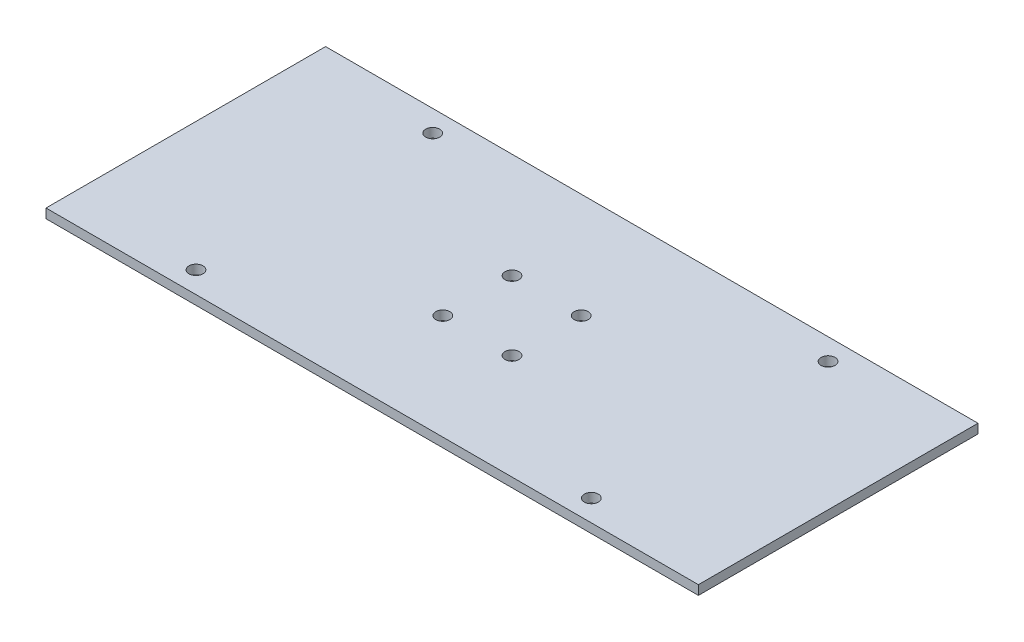
ISO-10303-21;
HEADER;
FILE_DESCRIPTION(('STEP AP214'),'2;1');
FILE_NAME('part.step','',(''),(''),'','','');
FILE_SCHEMA(('AUTOMOTIVE_DESIGN { 1 0 10303 214 1 1 1 1 }'));
ENDSEC;
DATA;
#1=APPLICATION_CONTEXT('core data for automotive mechanical design processes');
#2=APPLICATION_PROTOCOL_DEFINITION('international standard','automotive_design',2000,#1);
#3=PRODUCT_CONTEXT('',#1,'mechanical');
#4=PRODUCT('Part','Part','',(#3));
#5=PRODUCT_RELATED_PRODUCT_CATEGORY('part','',(#4));
#6=PRODUCT_DEFINITION_FORMATION('','',#4);
#7=PRODUCT_DEFINITION_CONTEXT('part definition',#1,'design');
#8=PRODUCT_DEFINITION('design','',#6,#7);
#9=PRODUCT_DEFINITION_SHAPE('','',#8);
#10=(LENGTH_UNIT() NAMED_UNIT(*) SI_UNIT(.MILLI.,.METRE.));
#11=(NAMED_UNIT(*) PLANE_ANGLE_UNIT() SI_UNIT($,.RADIAN.));
#12=(NAMED_UNIT(*) SI_UNIT($,.STERADIAN.) SOLID_ANGLE_UNIT());
#13=UNCERTAINTY_MEASURE_WITH_UNIT(LENGTH_MEASURE(1.E-05),#10,'distance_accuracy_value','');
#14=(GEOMETRIC_REPRESENTATION_CONTEXT(3) GLOBAL_UNCERTAINTY_ASSIGNED_CONTEXT((#13)) GLOBAL_UNIT_ASSIGNED_CONTEXT((#10,
#11,#12)) REPRESENTATION_CONTEXT('',''));
#15=CARTESIAN_POINT('',(0.,0.,0.));
#16=DIRECTION('',(0.,0.,1.));
#17=DIRECTION('',(1.,0.,0.));
#18=AXIS2_PLACEMENT_3D('',#15,#16,#17);
#19=CARTESIAN_POINT('',(0.,2.,0.));
#20=DIRECTION('',(0.,1.,0.));
#21=DIRECTION('',(0.,0.,1.));
#22=AXIS2_PLACEMENT_3D('',#19,#20,#21);
#23=PLANE('',#22);
#24=CARTESIAN_POINT('',(7.42499999999995,2.,7.42500000000005));
#25=DIRECTION('',(0.,1.,0.));
#26=DIRECTION('',(0.,0.,1.));
#27=AXIS2_PLACEMENT_3D('',#24,#25,#26);
#28=CIRCLE('',#27,1.5);
#29=CARTESIAN_POINT('',(7.42499999999995,2.,8.92500000000005));
#30=VERTEX_POINT('',#29);
#31=EDGE_CURVE('E148',#30,#30,#28,.T.);
#32=ORIENTED_EDGE('',*,*,#31,.F.);
#33=EDGE_LOOP('',(#32));
#34=FACE_BOUND('',#33,.T.);
#35=CARTESIAN_POINT('',(-7.425,2.,-7.425));
#36=DIRECTION('',(0.,1.,0.));
#37=DIRECTION('',(0.,0.,1.));
#38=AXIS2_PLACEMENT_3D('',#35,#36,#37);
#39=CIRCLE('',#38,1.5);
#40=CARTESIAN_POINT('',(-7.425,2.,-5.925));
#41=VERTEX_POINT('',#40);
#42=EDGE_CURVE('E136',#41,#41,#39,.T.);
#43=ORIENTED_EDGE('',*,*,#42,.F.);
#44=EDGE_LOOP('',(#43));
#45=FACE_BOUND('',#44,.T.);
#46=CARTESIAN_POINT('',(42.42,2.,25.4));
#47=DIRECTION('',(0.,1.,0.));
#48=DIRECTION('',(0.,0.,1.));
#49=AXIS2_PLACEMENT_3D('',#46,#47,#48);
#50=CIRCLE('',#49,1.5);
#51=CARTESIAN_POINT('',(42.42,2.,26.9));
#52=VERTEX_POINT('',#51);
#53=EDGE_CURVE('E124',#52,#52,#50,.T.);
#54=ORIENTED_EDGE('',*,*,#53,.F.);
#55=EDGE_LOOP('',(#54));
#56=FACE_BOUND('',#55,.T.);
#57=CARTESIAN_POINT('',(-42.42,2.,-25.4));
#58=DIRECTION('',(0.,1.,0.));
#59=DIRECTION('',(0.,0.,1.));
#60=AXIS2_PLACEMENT_3D('',#57,#58,#59);
#61=CIRCLE('',#60,1.5);
#62=CARTESIAN_POINT('',(-42.42,2.,-23.9));
#63=VERTEX_POINT('',#62);
#64=EDGE_CURVE('E103',#63,#63,#61,.T.);
#65=ORIENTED_EDGE('',*,*,#64,.F.);
#66=EDGE_LOOP('',(#65));
#67=FACE_BOUND('',#66,.T.);
#68=DIRECTION('',(0.,0.,-1.));
#69=VECTOR('',#68,1.);
#70=CARTESIAN_POINT('',(70.,2.,-30.));
#71=LINE('',#70,#69);
#72=CARTESIAN_POINT('',(70.,2.,30.));
#73=VERTEX_POINT('',#72);
#74=CARTESIAN_POINT('',(70.,2.,-30.));
#75=VERTEX_POINT('',#74);
#76=EDGE_CURVE('E88',#73,#75,#71,.T.);
#77=ORIENTED_EDGE('',*,*,#76,.T.);
#78=DIRECTION('',(-1.,0.,0.));
#79=VECTOR('',#78,1.);
#80=CARTESIAN_POINT('',(-70.,2.,-30.));
#81=LINE('',#80,#79);
#82=CARTESIAN_POINT('',(-70.,2.,-30.));
#83=VERTEX_POINT('',#82);
#84=EDGE_CURVE('E83',#75,#83,#81,.T.);
#85=ORIENTED_EDGE('',*,*,#84,.T.);
#86=DIRECTION('',(0.,0.,1.));
#87=VECTOR('',#86,1.);
#88=CARTESIAN_POINT('',(-70.,2.,-30.));
#89=LINE('',#88,#87);
#90=CARTESIAN_POINT('',(-70.,2.,30.));
#91=VERTEX_POINT('',#90);
#92=EDGE_CURVE('E86',#83,#91,#89,.T.);
#93=ORIENTED_EDGE('',*,*,#92,.T.);
#94=DIRECTION('',(1.,0.,0.));
#95=VECTOR('',#94,1.);
#96=CARTESIAN_POINT('',(-70.,2.,30.));
#97=LINE('',#96,#95);
#98=EDGE_CURVE('E53',#91,#73,#97,.T.);
#99=ORIENTED_EDGE('',*,*,#98,.T.);
#100=EDGE_LOOP('',(#77,#85,#93,#99));
#101=FACE_BOUND('',#100,.T.);
#102=CARTESIAN_POINT('',(-42.42,2.,25.4));
#103=DIRECTION('',(0.,1.,0.));
#104=DIRECTION('',(0.,0.,-1.));
#105=AXIS2_PLACEMENT_3D('',#102,#103,#104);
#106=CIRCLE('',#105,1.5);
#107=CARTESIAN_POINT('',(-42.42,2.,23.9));
#108=VERTEX_POINT('',#107);
#109=EDGE_CURVE('E118',#108,#108,#106,.T.);
#110=ORIENTED_EDGE('',*,*,#109,.F.);
#111=EDGE_LOOP('',(#110));
#112=FACE_BOUND('',#111,.T.);
#113=CARTESIAN_POINT('',(42.42,2.,-25.4));
#114=DIRECTION('',(0.,1.,0.));
#115=DIRECTION('',(0.,0.,-1.));
#116=AXIS2_PLACEMENT_3D('',#113,#114,#115);
#117=CIRCLE('',#116,1.5);
#118=CARTESIAN_POINT('',(42.42,2.,-26.9));
#119=VERTEX_POINT('',#118);
#120=EDGE_CURVE('E130',#119,#119,#117,.T.);
#121=ORIENTED_EDGE('',*,*,#120,.F.);
#122=EDGE_LOOP('',(#121));
#123=FACE_BOUND('',#122,.T.);
#124=CARTESIAN_POINT('',(7.42500000000003,2.,-7.42499999999997));
#125=DIRECTION('',(0.,1.,0.));
#126=DIRECTION('',(0.,0.,1.));
#127=AXIS2_PLACEMENT_3D('',#124,#125,#126);
#128=CIRCLE('',#127,1.5);
#129=CARTESIAN_POINT('',(7.42500000000003,2.,-5.92499999999998));
#130=VERTEX_POINT('',#129);
#131=EDGE_CURVE('E142',#130,#130,#128,.T.);
#132=ORIENTED_EDGE('',*,*,#131,.F.);
#133=EDGE_LOOP('',(#132));
#134=FACE_BOUND('',#133,.T.);
#135=CARTESIAN_POINT('',(-7.42500000000008,2.,7.42499999999992));
#136=DIRECTION('',(0.,1.,0.));
#137=DIRECTION('',(0.,0.,1.));
#138=AXIS2_PLACEMENT_3D('',#135,#136,#137);
#139=CIRCLE('',#138,1.5);
#140=CARTESIAN_POINT('',(-7.42500000000008,2.,8.92499999999992));
#141=VERTEX_POINT('',#140);
#142=EDGE_CURVE('E154',#141,#141,#139,.T.);
#143=ORIENTED_EDGE('',*,*,#142,.F.);
#144=EDGE_LOOP('',(#143));
#145=FACE_BOUND('',#144,.T.);
#146=ADVANCED_FACE('F36',(#34,#45,#56,#67,#101,#112,#123,#134,#145),#23,.T.);
#147=CARTESIAN_POINT('',(0.,0.,0.));
#148=DIRECTION('',(0.,1.,0.));
#149=DIRECTION('',(0.,0.,1.));
#150=AXIS2_PLACEMENT_3D('',#147,#148,#149);
#151=PLANE('',#150);
#152=DIRECTION('',(0.,0.,-1.));
#153=VECTOR('',#152,1.);
#154=CARTESIAN_POINT('',(70.,0.,-30.));
#155=LINE('',#154,#153);
#156=CARTESIAN_POINT('',(70.,0.,30.));
#157=VERTEX_POINT('',#156);
#158=CARTESIAN_POINT('',(70.,0.,-30.));
#159=VERTEX_POINT('',#158);
#160=EDGE_CURVE('E100',#157,#159,#155,.T.);
#161=ORIENTED_EDGE('',*,*,#160,.F.);
#162=DIRECTION('',(1.,0.,0.));
#163=VECTOR('',#162,1.);
#164=CARTESIAN_POINT('',(-70.,0.,30.));
#165=LINE('',#164,#163);
#166=CARTESIAN_POINT('',(-70.,0.,30.));
#167=VERTEX_POINT('',#166);
#168=EDGE_CURVE('E76',#167,#157,#165,.T.);
#169=ORIENTED_EDGE('',*,*,#168,.F.);
#170=DIRECTION('',(0.,0.,1.));
#171=VECTOR('',#170,1.);
#172=CARTESIAN_POINT('',(-70.,0.,-30.));
#173=LINE('',#172,#171);
#174=CARTESIAN_POINT('',(-70.,0.,-30.));
#175=VERTEX_POINT('',#174);
#176=EDGE_CURVE('E70',#175,#167,#173,.T.);
#177=ORIENTED_EDGE('',*,*,#176,.F.);
#178=DIRECTION('',(-1.,0.,0.));
#179=VECTOR('',#178,1.);
#180=CARTESIAN_POINT('',(-70.,0.,-30.));
#181=LINE('',#180,#179);
#182=EDGE_CURVE('E92',#159,#175,#181,.T.);
#183=ORIENTED_EDGE('',*,*,#182,.F.);
#184=EDGE_LOOP('',(#161,#169,#177,#183));
#185=FACE_BOUND('',#184,.T.);
#186=CARTESIAN_POINT('',(-42.42,0.,-25.4));
#187=DIRECTION('',(0.,1.,0.));
#188=DIRECTION('',(0.,0.,1.));
#189=AXIS2_PLACEMENT_3D('',#186,#187,#188);
#190=CIRCLE('',#189,1.5);
#191=CARTESIAN_POINT('',(-42.42,0.,-23.9));
#192=VERTEX_POINT('',#191);
#193=EDGE_CURVE('E115',#192,#192,#190,.T.);
#194=ORIENTED_EDGE('',*,*,#193,.T.);
#195=EDGE_LOOP('',(#194));
#196=FACE_BOUND('',#195,.T.);
#197=CARTESIAN_POINT('',(-42.42,0.,25.4));
#198=DIRECTION('',(0.,1.,0.));
#199=DIRECTION('',(0.,0.,-1.));
#200=AXIS2_PLACEMENT_3D('',#197,#198,#199);
#201=CIRCLE('',#200,1.5);
#202=CARTESIAN_POINT('',(-42.42,0.,23.9));
#203=VERTEX_POINT('',#202);
#204=EDGE_CURVE('E121',#203,#203,#201,.T.);
#205=ORIENTED_EDGE('',*,*,#204,.T.);
#206=EDGE_LOOP('',(#205));
#207=FACE_BOUND('',#206,.T.);
#208=CARTESIAN_POINT('',(42.42,0.,25.4));
#209=DIRECTION('',(0.,1.,0.));
#210=DIRECTION('',(0.,0.,1.));
#211=AXIS2_PLACEMENT_3D('',#208,#209,#210);
#212=CIRCLE('',#211,1.5);
#213=CARTESIAN_POINT('',(42.42,0.,26.9));
#214=VERTEX_POINT('',#213);
#215=EDGE_CURVE('E127',#214,#214,#212,.T.);
#216=ORIENTED_EDGE('',*,*,#215,.T.);
#217=EDGE_LOOP('',(#216));
#218=FACE_BOUND('',#217,.T.);
#219=CARTESIAN_POINT('',(42.42,0.,-25.4));
#220=DIRECTION('',(0.,1.,0.));
#221=DIRECTION('',(0.,0.,-1.));
#222=AXIS2_PLACEMENT_3D('',#219,#220,#221);
#223=CIRCLE('',#222,1.5);
#224=CARTESIAN_POINT('',(42.42,0.,-26.9));
#225=VERTEX_POINT('',#224);
#226=EDGE_CURVE('E133',#225,#225,#223,.T.);
#227=ORIENTED_EDGE('',*,*,#226,.T.);
#228=EDGE_LOOP('',(#227));
#229=FACE_BOUND('',#228,.T.);
#230=CARTESIAN_POINT('',(-7.425,0.,-7.425));
#231=DIRECTION('',(0.,1.,0.));
#232=DIRECTION('',(0.,0.,1.));
#233=AXIS2_PLACEMENT_3D('',#230,#231,#232);
#234=CIRCLE('',#233,1.5);
#235=CARTESIAN_POINT('',(-7.425,0.,-5.925));
#236=VERTEX_POINT('',#235);
#237=EDGE_CURVE('E139',#236,#236,#234,.T.);
#238=ORIENTED_EDGE('',*,*,#237,.T.);
#239=EDGE_LOOP('',(#238));
#240=FACE_BOUND('',#239,.T.);
#241=CARTESIAN_POINT('',(7.42500000000003,0.,-7.42499999999997));
#242=DIRECTION('',(0.,1.,0.));
#243=DIRECTION('',(0.,0.,1.));
#244=AXIS2_PLACEMENT_3D('',#241,#242,#243);
#245=CIRCLE('',#244,1.5);
#246=CARTESIAN_POINT('',(7.42500000000003,0.,-5.92499999999998));
#247=VERTEX_POINT('',#246);
#248=EDGE_CURVE('E145',#247,#247,#245,.T.);
#249=ORIENTED_EDGE('',*,*,#248,.T.);
#250=EDGE_LOOP('',(#249));
#251=FACE_BOUND('',#250,.T.);
#252=CARTESIAN_POINT('',(7.42499999999995,0.,7.42500000000005));
#253=DIRECTION('',(0.,1.,0.));
#254=DIRECTION('',(0.,0.,1.));
#255=AXIS2_PLACEMENT_3D('',#252,#253,#254);
#256=CIRCLE('',#255,1.5);
#257=CARTESIAN_POINT('',(7.42499999999995,0.,8.92500000000005));
#258=VERTEX_POINT('',#257);
#259=EDGE_CURVE('E151',#258,#258,#256,.T.);
#260=ORIENTED_EDGE('',*,*,#259,.T.);
#261=EDGE_LOOP('',(#260));
#262=FACE_BOUND('',#261,.T.);
#263=CARTESIAN_POINT('',(-7.42500000000008,0.,7.42499999999992));
#264=DIRECTION('',(0.,1.,0.));
#265=DIRECTION('',(0.,0.,1.));
#266=AXIS2_PLACEMENT_3D('',#263,#264,#265);
#267=CIRCLE('',#266,1.5);
#268=CARTESIAN_POINT('',(-7.42500000000008,0.,8.92499999999992));
#269=VERTEX_POINT('',#268);
#270=EDGE_CURVE('E157',#269,#269,#267,.T.);
#271=ORIENTED_EDGE('',*,*,#270,.T.);
#272=EDGE_LOOP('',(#271));
#273=FACE_BOUND('',#272,.T.);
#274=ADVANCED_FACE('F111',(#185,#196,#207,#218,#229,#240,#251,#262,#273),#151,.F.);
#275=CARTESIAN_POINT('',(70.,2.,-30.));
#276=DIRECTION('',(-1.,0.,0.));
#277=DIRECTION('',(0.,0.,1.));
#278=AXIS2_PLACEMENT_3D('',#275,#276,#277);
#279=PLANE('',#278);
#280=ORIENTED_EDGE('',*,*,#160,.T.);
#281=DIRECTION('',(0.,-1.,0.));
#282=VECTOR('',#281,1.);
#283=CARTESIAN_POINT('',(70.,2.,-30.));
#284=LINE('',#283,#282);
#285=EDGE_CURVE('E11',#75,#159,#284,.T.);
#286=ORIENTED_EDGE('',*,*,#285,.F.);
#287=ORIENTED_EDGE('',*,*,#76,.F.);
#288=DIRECTION('',(0.,-1.,0.));
#289=VECTOR('',#288,1.);
#290=CARTESIAN_POINT('',(70.,2.,30.));
#291=LINE('',#290,#289);
#292=EDGE_CURVE('E96',#73,#157,#291,.T.);
#293=ORIENTED_EDGE('',*,*,#292,.T.);
#294=EDGE_LOOP('',(#280,#286,#287,#293));
#295=FACE_BOUND('',#294,.T.);
#296=ADVANCED_FACE('F38',(#295),#279,.F.);
#297=CARTESIAN_POINT('',(-70.,2.,-30.));
#298=DIRECTION('',(0.,0.,1.));
#299=DIRECTION('',(1.,0.,0.));
#300=AXIS2_PLACEMENT_3D('',#297,#298,#299);
#301=PLANE('',#300);
#302=ORIENTED_EDGE('',*,*,#182,.T.);
#303=DIRECTION('',(0.,-1.,0.));
#304=VECTOR('',#303,1.);
#305=CARTESIAN_POINT('',(-70.,2.,-30.));
#306=LINE('',#305,#304);
#307=EDGE_CURVE('E45',#83,#175,#306,.T.);
#308=ORIENTED_EDGE('',*,*,#307,.F.);
#309=ORIENTED_EDGE('',*,*,#84,.F.);
#310=ORIENTED_EDGE('',*,*,#285,.T.);
#311=EDGE_LOOP('',(#302,#308,#309,#310));
#312=FACE_BOUND('',#311,.T.);
#313=ADVANCED_FACE('F91',(#312),#301,.F.);
#314=CARTESIAN_POINT('',(-70.,2.,-30.));
#315=DIRECTION('',(1.,0.,0.));
#316=DIRECTION('',(0.,0.,-1.));
#317=AXIS2_PLACEMENT_3D('',#314,#315,#316);
#318=PLANE('',#317);
#319=ORIENTED_EDGE('',*,*,#176,.T.);
#320=DIRECTION('',(0.,-1.,0.));
#321=VECTOR('',#320,1.);
#322=CARTESIAN_POINT('',(-70.,2.,30.));
#323=LINE('',#322,#321);
#324=EDGE_CURVE('E93',#91,#167,#323,.T.);
#325=ORIENTED_EDGE('',*,*,#324,.F.);
#326=ORIENTED_EDGE('',*,*,#92,.F.);
#327=ORIENTED_EDGE('',*,*,#307,.T.);
#328=EDGE_LOOP('',(#319,#325,#326,#327));
#329=FACE_BOUND('',#328,.T.);
#330=ADVANCED_FACE('F94',(#329),#318,.F.);
#331=CARTESIAN_POINT('',(-70.,2.,30.));
#332=DIRECTION('',(0.,0.,-1.));
#333=DIRECTION('',(-1.,0.,0.));
#334=AXIS2_PLACEMENT_3D('',#331,#332,#333);
#335=PLANE('',#334);
#336=ORIENTED_EDGE('',*,*,#168,.T.);
#337=ORIENTED_EDGE('',*,*,#292,.F.);
#338=ORIENTED_EDGE('',*,*,#98,.F.);
#339=ORIENTED_EDGE('',*,*,#324,.T.);
#340=EDGE_LOOP('',(#336,#337,#338,#339));
#341=FACE_BOUND('',#340,.T.);
#342=ADVANCED_FACE('F108',(#341),#335,.F.);
#343=CARTESIAN_POINT('',(-42.42,2.,-25.4));
#344=DIRECTION('',(0.,-1.,0.));
#345=DIRECTION('',(0.,0.,-1.));
#346=AXIS2_PLACEMENT_3D('',#343,#344,#345);
#347=CYLINDRICAL_SURFACE('',#346,1.5);
#348=ORIENTED_EDGE('',*,*,#64,.T.);
#349=EDGE_LOOP('',(#348));
#350=FACE_BOUND('',#349,.T.);
#351=ORIENTED_EDGE('',*,*,#193,.F.);
#352=EDGE_LOOP('',(#351));
#353=FACE_BOUND('',#352,.T.);
#354=ADVANCED_FACE('F176',(#350,#353),#347,.F.);
#355=CARTESIAN_POINT('',(-42.42,2.,25.4));
#356=DIRECTION('',(0.,-1.,0.));
#357=DIRECTION('',(0.,0.,-1.));
#358=AXIS2_PLACEMENT_3D('',#355,#356,#357);
#359=CYLINDRICAL_SURFACE('',#358,1.5);
#360=ORIENTED_EDGE('',*,*,#109,.T.);
#361=EDGE_LOOP('',(#360));
#362=FACE_BOUND('',#361,.T.);
#363=ORIENTED_EDGE('',*,*,#204,.F.);
#364=EDGE_LOOP('',(#363));
#365=FACE_BOUND('',#364,.T.);
#366=ADVANCED_FACE('F222',(#362,#365),#359,.F.);
#367=CARTESIAN_POINT('',(42.42,2.,25.4));
#368=DIRECTION('',(0.,-1.,0.));
#369=DIRECTION('',(0.,0.,-1.));
#370=AXIS2_PLACEMENT_3D('',#367,#368,#369);
#371=CYLINDRICAL_SURFACE('',#370,1.5);
#372=ORIENTED_EDGE('',*,*,#53,.T.);
#373=EDGE_LOOP('',(#372));
#374=FACE_BOUND('',#373,.T.);
#375=ORIENTED_EDGE('',*,*,#215,.F.);
#376=EDGE_LOOP('',(#375));
#377=FACE_BOUND('',#376,.T.);
#378=ADVANCED_FACE('F230',(#374,#377),#371,.F.);
#379=CARTESIAN_POINT('',(42.42,2.,-25.4));
#380=DIRECTION('',(0.,-1.,0.));
#381=DIRECTION('',(0.,0.,-1.));
#382=AXIS2_PLACEMENT_3D('',#379,#380,#381);
#383=CYLINDRICAL_SURFACE('',#382,1.5);
#384=ORIENTED_EDGE('',*,*,#120,.T.);
#385=EDGE_LOOP('',(#384));
#386=FACE_BOUND('',#385,.T.);
#387=ORIENTED_EDGE('',*,*,#226,.F.);
#388=EDGE_LOOP('',(#387));
#389=FACE_BOUND('',#388,.T.);
#390=ADVANCED_FACE('F238',(#386,#389),#383,.F.);
#391=CARTESIAN_POINT('',(-7.425,2.,-7.425));
#392=DIRECTION('',(0.,-1.,0.));
#393=DIRECTION('',(0.,0.,-1.));
#394=AXIS2_PLACEMENT_3D('',#391,#392,#393);
#395=CYLINDRICAL_SURFACE('',#394,1.5);
#396=ORIENTED_EDGE('',*,*,#42,.T.);
#397=EDGE_LOOP('',(#396));
#398=FACE_BOUND('',#397,.T.);
#399=ORIENTED_EDGE('',*,*,#237,.F.);
#400=EDGE_LOOP('',(#399));
#401=FACE_BOUND('',#400,.T.);
#402=ADVANCED_FACE('F247',(#398,#401),#395,.F.);
#403=CARTESIAN_POINT('',(7.42500000000003,2.,-7.42499999999997));
#404=DIRECTION('',(0.,-1.,0.));
#405=DIRECTION('',(0.,0.,-1.));
#406=AXIS2_PLACEMENT_3D('',#403,#404,#405);
#407=CYLINDRICAL_SURFACE('',#406,1.5);
#408=ORIENTED_EDGE('',*,*,#131,.T.);
#409=EDGE_LOOP('',(#408));
#410=FACE_BOUND('',#409,.T.);
#411=ORIENTED_EDGE('',*,*,#248,.F.);
#412=EDGE_LOOP('',(#411));
#413=FACE_BOUND('',#412,.T.);
#414=ADVANCED_FACE('F256',(#410,#413),#407,.F.);
#415=CARTESIAN_POINT('',(7.42499999999995,2.,7.42500000000005));
#416=DIRECTION('',(0.,-1.,0.));
#417=DIRECTION('',(0.,0.,-1.));
#418=AXIS2_PLACEMENT_3D('',#415,#416,#417);
#419=CYLINDRICAL_SURFACE('',#418,1.5);
#420=ORIENTED_EDGE('',*,*,#31,.T.);
#421=EDGE_LOOP('',(#420));
#422=FACE_BOUND('',#421,.T.);
#423=ORIENTED_EDGE('',*,*,#259,.F.);
#424=EDGE_LOOP('',(#423));
#425=FACE_BOUND('',#424,.T.);
#426=ADVANCED_FACE('F265',(#422,#425),#419,.F.);
#427=CARTESIAN_POINT('',(-7.42500000000008,2.,7.42499999999992));
#428=DIRECTION('',(0.,-1.,0.));
#429=DIRECTION('',(0.,0.,-1.));
#430=AXIS2_PLACEMENT_3D('',#427,#428,#429);
#431=CYLINDRICAL_SURFACE('',#430,1.5);
#432=ORIENTED_EDGE('',*,*,#142,.T.);
#433=EDGE_LOOP('',(#432));
#434=FACE_BOUND('',#433,.T.);
#435=ORIENTED_EDGE('',*,*,#270,.F.);
#436=EDGE_LOOP('',(#435));
#437=FACE_BOUND('',#436,.T.);
#438=ADVANCED_FACE('F163',(#434,#437),#431,.F.);
#439=CLOSED_SHELL('',(#146,#274,#296,#313,#330,#342,#354,#366,#378,#390,#402,#414,#426,#438));
#440=MANIFOLD_SOLID_BREP('B2',#439);
#441=ADVANCED_BREP_SHAPE_REPRESENTATION('',(#18,#440),#14);
#442=SHAPE_DEFINITION_REPRESENTATION(#9,#441);
ENDSEC;
END-ISO-10303-21;
